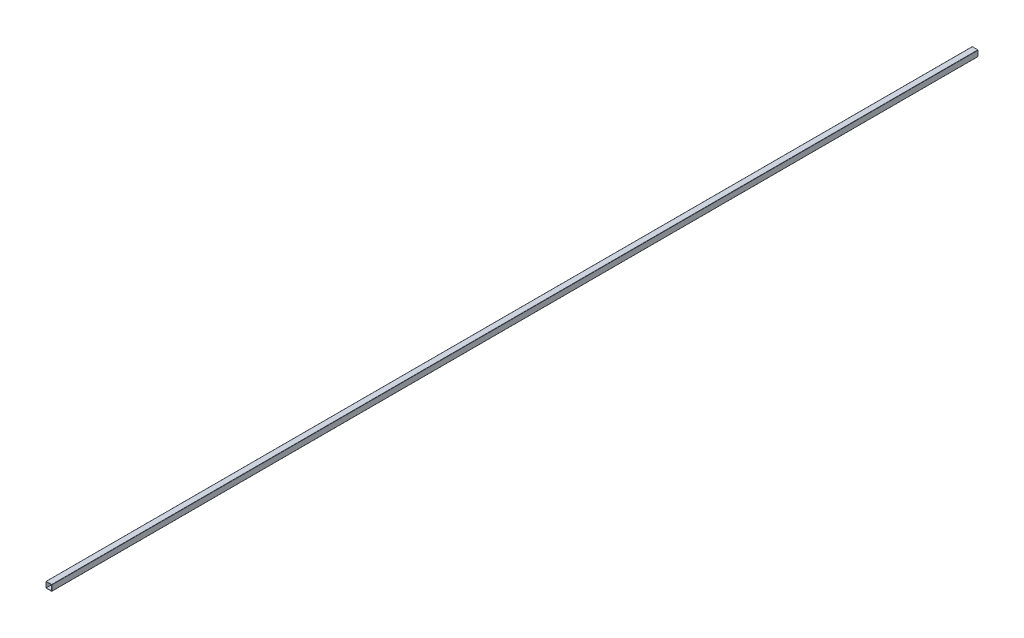
ISO-10303-21;
HEADER;
FILE_DESCRIPTION(('STEP AP214'),'2;1');
FILE_NAME('part.step','',(''),(''),'','','');
FILE_SCHEMA(('AUTOMOTIVE_DESIGN { 1 0 10303 214 1 1 1 1 }'));
ENDSEC;
DATA;
#1=APPLICATION_CONTEXT('core data for automotive mechanical design processes');
#2=APPLICATION_PROTOCOL_DEFINITION('international standard','automotive_design',2000,#1);
#3=PRODUCT_CONTEXT('',#1,'mechanical');
#4=PRODUCT('Part','Part','',(#3));
#5=PRODUCT_RELATED_PRODUCT_CATEGORY('part','',(#4));
#6=PRODUCT_DEFINITION_FORMATION('','',#4);
#7=PRODUCT_DEFINITION_CONTEXT('part definition',#1,'design');
#8=PRODUCT_DEFINITION('design','',#6,#7);
#9=PRODUCT_DEFINITION_SHAPE('','',#8);
#10=(LENGTH_UNIT() NAMED_UNIT(*) SI_UNIT(.MILLI.,.METRE.));
#11=(NAMED_UNIT(*) PLANE_ANGLE_UNIT() SI_UNIT($,.RADIAN.));
#12=(NAMED_UNIT(*) SI_UNIT($,.STERADIAN.) SOLID_ANGLE_UNIT());
#13=UNCERTAINTY_MEASURE_WITH_UNIT(LENGTH_MEASURE(1.E-05),#10,'distance_accuracy_value','');
#14=(GEOMETRIC_REPRESENTATION_CONTEXT(3) GLOBAL_UNCERTAINTY_ASSIGNED_CONTEXT((#13)) GLOBAL_UNIT_ASSIGNED_CONTEXT((#10,
#11,#12)) REPRESENTATION_CONTEXT('',''));
#15=CARTESIAN_POINT('',(0.,0.,0.));
#16=DIRECTION('',(0.,0.,1.));
#17=DIRECTION('',(1.,0.,0.));
#18=AXIS2_PLACEMENT_3D('',#15,#16,#17);
#19=CARTESIAN_POINT('',(17.55,17.55,6000.));
#20=DIRECTION('',(0.,0.,-1.));
#21=DIRECTION('',(-1.,0.,0.));
#22=AXIS2_PLACEMENT_3D('',#19,#20,#21);
#23=PLANE('',#22);
#24=CARTESIAN_POINT('',(17.55,17.55,6000.));
#25=DIRECTION('',(0.,0.,1.));
#26=DIRECTION('',(-1.,0.,0.));
#27=AXIS2_PLACEMENT_3D('',#24,#25,#26);
#28=CIRCLE('',#27,1.5);
#29=CARTESIAN_POINT('',(19.05,17.55,6000.));
#30=VERTEX_POINT('',#29);
#31=CARTESIAN_POINT('',(17.55,19.05,6000.));
#32=VERTEX_POINT('',#31);
#33=EDGE_CURVE('E158',#30,#32,#28,.T.);
#34=ORIENTED_EDGE('',*,*,#33,.T.);
#35=DIRECTION('',(-1.,0.,0.));
#36=VECTOR('',#35,1.);
#37=CARTESIAN_POINT('',(-17.55,19.05,6000.));
#38=LINE('',#37,#36);
#39=CARTESIAN_POINT('',(-17.55,19.05,6000.));
#40=VERTEX_POINT('',#39);
#41=EDGE_CURVE('E161',#32,#40,#38,.T.);
#42=ORIENTED_EDGE('',*,*,#41,.T.);
#43=CARTESIAN_POINT('',(-17.55,17.55,6000.));
#44=DIRECTION('',(0.,0.,1.));
#45=DIRECTION('',(-1.,0.,0.));
#46=AXIS2_PLACEMENT_3D('',#43,#44,#45);
#47=CIRCLE('',#46,1.5);
#48=CARTESIAN_POINT('',(-19.05,17.55,6000.));
#49=VERTEX_POINT('',#48);
#50=EDGE_CURVE('E164',#40,#49,#47,.T.);
#51=ORIENTED_EDGE('',*,*,#50,.T.);
#52=DIRECTION('',(0.,-1.,0.));
#53=VECTOR('',#52,1.);
#54=CARTESIAN_POINT('',(-19.05,-17.55,6000.));
#55=LINE('',#54,#53);
#56=CARTESIAN_POINT('',(-19.05,-17.55,6000.));
#57=VERTEX_POINT('',#56);
#58=EDGE_CURVE('E166',#49,#57,#55,.T.);
#59=ORIENTED_EDGE('',*,*,#58,.T.);
#60=CARTESIAN_POINT('',(-17.55,-17.55,6000.));
#61=DIRECTION('',(0.,0.,1.));
#62=DIRECTION('',(-1.,0.,0.));
#63=AXIS2_PLACEMENT_3D('',#60,#61,#62);
#64=CIRCLE('',#63,1.5);
#65=CARTESIAN_POINT('',(-17.55,-19.05,6000.));
#66=VERTEX_POINT('',#65);
#67=EDGE_CURVE('E168',#57,#66,#64,.T.);
#68=ORIENTED_EDGE('',*,*,#67,.T.);
#69=DIRECTION('',(1.,0.,0.));
#70=VECTOR('',#69,1.);
#71=CARTESIAN_POINT('',(-17.55,-19.05,6000.));
#72=LINE('',#71,#70);
#73=CARTESIAN_POINT('',(17.55,-19.05,6000.));
#74=VERTEX_POINT('',#73);
#75=EDGE_CURVE('E170',#66,#74,#72,.T.);
#76=ORIENTED_EDGE('',*,*,#75,.T.);
#77=CARTESIAN_POINT('',(17.55,-17.55,6000.));
#78=DIRECTION('',(0.,0.,1.));
#79=DIRECTION('',(1.,0.,0.));
#80=AXIS2_PLACEMENT_3D('',#77,#78,#79);
#81=CIRCLE('',#80,1.5);
#82=CARTESIAN_POINT('',(19.05,-17.55,6000.));
#83=VERTEX_POINT('',#82);
#84=EDGE_CURVE('E172',#74,#83,#81,.T.);
#85=ORIENTED_EDGE('',*,*,#84,.T.);
#86=DIRECTION('',(0.,1.,0.));
#87=VECTOR('',#86,1.);
#88=CARTESIAN_POINT('',(19.05,-17.55,6000.));
#89=LINE('',#88,#87);
#90=EDGE_CURVE('E174',#83,#30,#89,.T.);
#91=ORIENTED_EDGE('',*,*,#90,.T.);
#92=EDGE_LOOP('',(#34,#42,#51,#59,#68,#76,#85,#91));
#93=FACE_BOUND('',#92,.T.);
#94=DIRECTION('',(1.,0.,0.));
#95=VECTOR('',#94,1.);
#96=CARTESIAN_POINT('',(-17.55,-17.55,6000.));
#97=LINE('',#96,#95);
#98=CARTESIAN_POINT('',(-17.55,-17.55,6000.));
#99=VERTEX_POINT('',#98);
#100=CARTESIAN_POINT('',(17.55,-17.55,6000.));
#101=VERTEX_POINT('',#100);
#102=EDGE_CURVE('E122',#99,#101,#97,.T.);
#103=ORIENTED_EDGE('',*,*,#102,.F.);
#104=DIRECTION('',(0.,-1.,0.));
#105=VECTOR('',#104,1.);
#106=CARTESIAN_POINT('',(-17.55,-17.55,6000.));
#107=LINE('',#106,#105);
#108=CARTESIAN_POINT('',(-17.55,17.55,6000.));
#109=VERTEX_POINT('',#108);
#110=EDGE_CURVE('E144',#109,#99,#107,.T.);
#111=ORIENTED_EDGE('',*,*,#110,.F.);
#112=DIRECTION('',(-1.,0.,0.));
#113=VECTOR('',#112,1.);
#114=CARTESIAN_POINT('',(-17.55,17.55,6000.));
#115=LINE('',#114,#113);
#116=CARTESIAN_POINT('',(17.55,17.55,6000.));
#117=VERTEX_POINT('',#116);
#118=EDGE_CURVE('E142',#117,#109,#115,.T.);
#119=ORIENTED_EDGE('',*,*,#118,.F.);
#120=DIRECTION('',(0.,1.,0.));
#121=VECTOR('',#120,1.);
#122=CARTESIAN_POINT('',(17.55,-17.55,6000.));
#123=LINE('',#122,#121);
#124=EDGE_CURVE('E130',#101,#117,#123,.T.);
#125=ORIENTED_EDGE('',*,*,#124,.F.);
#126=EDGE_LOOP('',(#103,#111,#119,#125));
#127=FACE_BOUND('',#126,.T.);
#128=ADVANCED_FACE('F33',(#93,#127),#23,.F.);
#129=CARTESIAN_POINT('',(17.55,17.55,0.));
#130=DIRECTION('',(0.,0.,-1.));
#131=DIRECTION('',(-1.,0.,0.));
#132=AXIS2_PLACEMENT_3D('',#129,#130,#131);
#133=PLANE('',#132);
#134=CARTESIAN_POINT('',(17.55,17.55,0.));
#135=DIRECTION('',(0.,0.,1.));
#136=DIRECTION('',(-1.,0.,0.));
#137=AXIS2_PLACEMENT_3D('',#134,#135,#136);
#138=CIRCLE('',#137,1.5);
#139=CARTESIAN_POINT('',(19.05,17.55,0.));
#140=VERTEX_POINT('',#139);
#141=CARTESIAN_POINT('',(17.55,19.05,0.));
#142=VERTEX_POINT('',#141);
#143=EDGE_CURVE('E138',#140,#142,#138,.T.);
#144=ORIENTED_EDGE('',*,*,#143,.F.);
#145=DIRECTION('',(0.,1.,0.));
#146=VECTOR('',#145,1.);
#147=CARTESIAN_POINT('',(19.05,-17.55,0.));
#148=LINE('',#147,#146);
#149=CARTESIAN_POINT('',(19.05,-17.55,0.));
#150=VERTEX_POINT('',#149);
#151=EDGE_CURVE('E162',#150,#140,#148,.T.);
#152=ORIENTED_EDGE('',*,*,#151,.F.);
#153=CARTESIAN_POINT('',(17.55,-17.55,0.));
#154=DIRECTION('',(0.,0.,1.));
#155=DIRECTION('',(1.,0.,0.));
#156=AXIS2_PLACEMENT_3D('',#153,#154,#155);
#157=CIRCLE('',#156,1.5);
#158=CARTESIAN_POINT('',(17.55,-19.05,0.));
#159=VERTEX_POINT('',#158);
#160=EDGE_CURVE('E189',#159,#150,#157,.T.);
#161=ORIENTED_EDGE('',*,*,#160,.F.);
#162=DIRECTION('',(1.,0.,0.));
#163=VECTOR('',#162,1.);
#164=CARTESIAN_POINT('',(-17.55,-19.05,0.));
#165=LINE('',#164,#163);
#166=CARTESIAN_POINT('',(-17.55,-19.05,0.));
#167=VERTEX_POINT('',#166);
#168=EDGE_CURVE('E187',#167,#159,#165,.T.);
#169=ORIENTED_EDGE('',*,*,#168,.F.);
#170=CARTESIAN_POINT('',(-17.55,-17.55,0.));
#171=DIRECTION('',(0.,0.,1.));
#172=DIRECTION('',(-1.,0.,0.));
#173=AXIS2_PLACEMENT_3D('',#170,#171,#172);
#174=CIRCLE('',#173,1.5);
#175=CARTESIAN_POINT('',(-19.05,-17.55,0.));
#176=VERTEX_POINT('',#175);
#177=EDGE_CURVE('E185',#176,#167,#174,.T.);
#178=ORIENTED_EDGE('',*,*,#177,.F.);
#179=DIRECTION('',(0.,-1.,0.));
#180=VECTOR('',#179,1.);
#181=CARTESIAN_POINT('',(-19.05,-17.55,0.));
#182=LINE('',#181,#180);
#183=CARTESIAN_POINT('',(-19.05,17.55,0.));
#184=VERTEX_POINT('',#183);
#185=EDGE_CURVE('E183',#184,#176,#182,.T.);
#186=ORIENTED_EDGE('',*,*,#185,.F.);
#187=CARTESIAN_POINT('',(-17.55,17.55,0.));
#188=DIRECTION('',(0.,0.,1.));
#189=DIRECTION('',(-1.,0.,0.));
#190=AXIS2_PLACEMENT_3D('',#187,#188,#189);
#191=CIRCLE('',#190,1.5);
#192=CARTESIAN_POINT('',(-17.55,19.05,0.));
#193=VERTEX_POINT('',#192);
#194=EDGE_CURVE('E181',#193,#184,#191,.T.);
#195=ORIENTED_EDGE('',*,*,#194,.F.);
#196=DIRECTION('',(-1.,0.,0.));
#197=VECTOR('',#196,1.);
#198=CARTESIAN_POINT('',(-17.55,19.05,0.));
#199=LINE('',#198,#197);
#200=EDGE_CURVE('E179',#142,#193,#199,.T.);
#201=ORIENTED_EDGE('',*,*,#200,.F.);
#202=EDGE_LOOP('',(#144,#152,#161,#169,#178,#186,#195,#201));
#203=FACE_BOUND('',#202,.T.);
#204=DIRECTION('',(0.,-1.,0.));
#205=VECTOR('',#204,1.);
#206=CARTESIAN_POINT('',(-17.55,-17.55,0.));
#207=LINE('',#206,#205);
#208=CARTESIAN_POINT('',(-17.55,17.55,0.));
#209=VERTEX_POINT('',#208);
#210=CARTESIAN_POINT('',(-17.55,-17.55,0.));
#211=VERTEX_POINT('',#210);
#212=EDGE_CURVE('E131',#209,#211,#207,.T.);
#213=ORIENTED_EDGE('',*,*,#212,.T.);
#214=DIRECTION('',(1.,0.,0.));
#215=VECTOR('',#214,1.);
#216=CARTESIAN_POINT('',(-17.55,-17.55,0.));
#217=LINE('',#216,#215);
#218=CARTESIAN_POINT('',(17.55,-17.55,0.));
#219=VERTEX_POINT('',#218);
#220=EDGE_CURVE('E56',#211,#219,#217,.T.);
#221=ORIENTED_EDGE('',*,*,#220,.T.);
#222=DIRECTION('',(0.,1.,0.));
#223=VECTOR('',#222,1.);
#224=CARTESIAN_POINT('',(17.55,-17.55,0.));
#225=LINE('',#224,#223);
#226=CARTESIAN_POINT('',(17.55,17.55,0.));
#227=VERTEX_POINT('',#226);
#228=EDGE_CURVE('E137',#219,#227,#225,.T.);
#229=ORIENTED_EDGE('',*,*,#228,.T.);
#230=DIRECTION('',(-1.,0.,0.));
#231=VECTOR('',#230,1.);
#232=CARTESIAN_POINT('',(-17.55,17.55,0.));
#233=LINE('',#232,#231);
#234=EDGE_CURVE('E150',#227,#209,#233,.T.);
#235=ORIENTED_EDGE('',*,*,#234,.T.);
#236=EDGE_LOOP('',(#213,#221,#229,#235));
#237=FACE_BOUND('',#236,.T.);
#238=ADVANCED_FACE('F219',(#203,#237),#133,.T.);
#239=CARTESIAN_POINT('',(17.55,17.55,6000.));
#240=DIRECTION('',(0.,0.,-1.));
#241=DIRECTION('',(-1.,0.,0.));
#242=AXIS2_PLACEMENT_3D('',#239,#240,#241);
#243=CYLINDRICAL_SURFACE('',#242,1.5);
#244=ORIENTED_EDGE('',*,*,#143,.T.);
#245=DIRECTION('',(0.,0.,-1.));
#246=VECTOR('',#245,1.);
#247=CARTESIAN_POINT('',(17.55,19.05,6000.));
#248=LINE('',#247,#246);
#249=EDGE_CURVE('E11',#32,#142,#248,.T.);
#250=ORIENTED_EDGE('',*,*,#249,.F.);
#251=ORIENTED_EDGE('',*,*,#33,.F.);
#252=DIRECTION('',(0.,0.,-1.));
#253=VECTOR('',#252,1.);
#254=CARTESIAN_POINT('',(19.05,17.55,6000.));
#255=LINE('',#254,#253);
#256=EDGE_CURVE('E176',#30,#140,#255,.T.);
#257=ORIENTED_EDGE('',*,*,#256,.T.);
#258=EDGE_LOOP('',(#244,#250,#251,#257));
#259=FACE_BOUND('',#258,.T.);
#260=ADVANCED_FACE('F35',(#259),#243,.T.);
#261=CARTESIAN_POINT('',(-17.55,19.05,6000.));
#262=DIRECTION('',(0.,-1.,0.));
#263=DIRECTION('',(0.,0.,-1.));
#264=AXIS2_PLACEMENT_3D('',#261,#262,#263);
#265=PLANE('',#264);
#266=ORIENTED_EDGE('',*,*,#200,.T.);
#267=DIRECTION('',(0.,0.,-1.));
#268=VECTOR('',#267,1.);
#269=CARTESIAN_POINT('',(-17.55,19.05,6000.));
#270=LINE('',#269,#268);
#271=EDGE_CURVE('E41',#40,#193,#270,.T.);
#272=ORIENTED_EDGE('',*,*,#271,.F.);
#273=ORIENTED_EDGE('',*,*,#41,.F.);
#274=ORIENTED_EDGE('',*,*,#249,.T.);
#275=EDGE_LOOP('',(#266,#272,#273,#274));
#276=FACE_BOUND('',#275,.T.);
#277=ADVANCED_FACE('F236',(#276),#265,.F.);
#278=CARTESIAN_POINT('',(-17.55,17.55,6000.));
#279=DIRECTION('',(0.,0.,-1.));
#280=DIRECTION('',(-1.,0.,0.));
#281=AXIS2_PLACEMENT_3D('',#278,#279,#280);
#282=CYLINDRICAL_SURFACE('',#281,1.5);
#283=ORIENTED_EDGE('',*,*,#194,.T.);
#284=DIRECTION('',(0.,0.,-1.));
#285=VECTOR('',#284,1.);
#286=CARTESIAN_POINT('',(-19.05,17.55,6000.));
#287=LINE('',#286,#285);
#288=EDGE_CURVE('E206',#49,#184,#287,.T.);
#289=ORIENTED_EDGE('',*,*,#288,.F.);
#290=ORIENTED_EDGE('',*,*,#50,.F.);
#291=ORIENTED_EDGE('',*,*,#271,.T.);
#292=EDGE_LOOP('',(#283,#289,#290,#291));
#293=FACE_BOUND('',#292,.T.);
#294=ADVANCED_FACE('F213',(#293),#282,.T.);
#295=CARTESIAN_POINT('',(-19.05,-17.55,6000.));
#296=DIRECTION('',(1.,0.,0.));
#297=DIRECTION('',(0.,0.,-1.));
#298=AXIS2_PLACEMENT_3D('',#295,#296,#297);
#299=PLANE('',#298);
#300=ORIENTED_EDGE('',*,*,#185,.T.);
#301=DIRECTION('',(0.,0.,-1.));
#302=VECTOR('',#301,1.);
#303=CARTESIAN_POINT('',(-19.05,-17.55,6000.));
#304=LINE('',#303,#302);
#305=EDGE_CURVE('E203',#57,#176,#304,.T.);
#306=ORIENTED_EDGE('',*,*,#305,.F.);
#307=ORIENTED_EDGE('',*,*,#58,.F.);
#308=ORIENTED_EDGE('',*,*,#288,.T.);
#309=EDGE_LOOP('',(#300,#306,#307,#308));
#310=FACE_BOUND('',#309,.T.);
#311=ADVANCED_FACE('F225',(#310),#299,.F.);
#312=CARTESIAN_POINT('',(-17.55,-17.55,6000.));
#313=DIRECTION('',(0.,0.,-1.));
#314=DIRECTION('',(-1.,0.,0.));
#315=AXIS2_PLACEMENT_3D('',#312,#313,#314);
#316=CYLINDRICAL_SURFACE('',#315,1.5);
#317=ORIENTED_EDGE('',*,*,#177,.T.);
#318=DIRECTION('',(0.,0.,-1.));
#319=VECTOR('',#318,1.);
#320=CARTESIAN_POINT('',(-17.55,-19.05,6000.));
#321=LINE('',#320,#319);
#322=EDGE_CURVE('E200',#66,#167,#321,.T.);
#323=ORIENTED_EDGE('',*,*,#322,.F.);
#324=ORIENTED_EDGE('',*,*,#67,.F.);
#325=ORIENTED_EDGE('',*,*,#305,.T.);
#326=EDGE_LOOP('',(#317,#323,#324,#325));
#327=FACE_BOUND('',#326,.T.);
#328=ADVANCED_FACE('F229',(#327),#316,.T.);
#329=CARTESIAN_POINT('',(-17.55,-19.05,6000.));
#330=DIRECTION('',(0.,1.,0.));
#331=DIRECTION('',(0.,0.,1.));
#332=AXIS2_PLACEMENT_3D('',#329,#330,#331);
#333=PLANE('',#332);
#334=ORIENTED_EDGE('',*,*,#168,.T.);
#335=DIRECTION('',(0.,0.,-1.));
#336=VECTOR('',#335,1.);
#337=CARTESIAN_POINT('',(17.55,-19.05,6000.));
#338=LINE('',#337,#336);
#339=EDGE_CURVE('E197',#74,#159,#338,.T.);
#340=ORIENTED_EDGE('',*,*,#339,.F.);
#341=ORIENTED_EDGE('',*,*,#75,.F.);
#342=ORIENTED_EDGE('',*,*,#322,.T.);
#343=EDGE_LOOP('',(#334,#340,#341,#342));
#344=FACE_BOUND('',#343,.T.);
#345=ADVANCED_FACE('F249',(#344),#333,.F.);
#346=CARTESIAN_POINT('',(17.55,-17.55,6000.));
#347=DIRECTION('',(0.,0.,-1.));
#348=DIRECTION('',(-1.,0.,0.));
#349=AXIS2_PLACEMENT_3D('',#346,#347,#348);
#350=CYLINDRICAL_SURFACE('',#349,1.5);
#351=ORIENTED_EDGE('',*,*,#160,.T.);
#352=DIRECTION('',(0.,0.,-1.));
#353=VECTOR('',#352,1.);
#354=CARTESIAN_POINT('',(19.05,-17.55,6000.));
#355=LINE('',#354,#353);
#356=EDGE_CURVE('E194',#83,#150,#355,.T.);
#357=ORIENTED_EDGE('',*,*,#356,.F.);
#358=ORIENTED_EDGE('',*,*,#84,.F.);
#359=ORIENTED_EDGE('',*,*,#339,.T.);
#360=EDGE_LOOP('',(#351,#357,#358,#359));
#361=FACE_BOUND('',#360,.T.);
#362=ADVANCED_FACE('F247',(#361),#350,.T.);
#363=CARTESIAN_POINT('',(19.05,-17.55,6000.));
#364=DIRECTION('',(-1.,0.,0.));
#365=DIRECTION('',(0.,0.,1.));
#366=AXIS2_PLACEMENT_3D('',#363,#364,#365);
#367=PLANE('',#366);
#368=ORIENTED_EDGE('',*,*,#151,.T.);
#369=ORIENTED_EDGE('',*,*,#256,.F.);
#370=ORIENTED_EDGE('',*,*,#90,.F.);
#371=ORIENTED_EDGE('',*,*,#356,.T.);
#372=EDGE_LOOP('',(#368,#369,#370,#371));
#373=FACE_BOUND('',#372,.T.);
#374=ADVANCED_FACE('F242',(#373),#367,.F.);
#375=CARTESIAN_POINT('',(-17.55,-17.55,6000.));
#376=DIRECTION('',(0.,1.,0.));
#377=DIRECTION('',(-1.,0.,0.));
#378=AXIS2_PLACEMENT_3D('',#375,#376,#377);
#379=PLANE('',#378);
#380=ORIENTED_EDGE('',*,*,#220,.F.);
#381=DIRECTION('',(0.,0.,-1.));
#382=VECTOR('',#381,1.);
#383=CARTESIAN_POINT('',(-17.55,-17.55,6000.));
#384=LINE('',#383,#382);
#385=EDGE_CURVE('E126',#99,#211,#384,.T.);
#386=ORIENTED_EDGE('',*,*,#385,.F.);
#387=ORIENTED_EDGE('',*,*,#102,.T.);
#388=DIRECTION('',(0.,0.,-1.));
#389=VECTOR('',#388,1.);
#390=CARTESIAN_POINT('',(17.55,-17.55,6000.));
#391=LINE('',#390,#389);
#392=EDGE_CURVE('E125',#101,#219,#391,.T.);
#393=ORIENTED_EDGE('',*,*,#392,.T.);
#394=EDGE_LOOP('',(#380,#386,#387,#393));
#395=FACE_BOUND('',#394,.T.);
#396=ADVANCED_FACE('F124',(#395),#379,.T.);
#397=CARTESIAN_POINT('',(17.55,-17.55,6000.));
#398=DIRECTION('',(-1.,0.,0.));
#399=DIRECTION('',(0.,-1.,0.));
#400=AXIS2_PLACEMENT_3D('',#397,#398,#399);
#401=PLANE('',#400);
#402=ORIENTED_EDGE('',*,*,#228,.F.);
#403=ORIENTED_EDGE('',*,*,#392,.F.);
#404=ORIENTED_EDGE('',*,*,#124,.T.);
#405=DIRECTION('',(0.,0.,-1.));
#406=VECTOR('',#405,1.);
#407=CARTESIAN_POINT('',(17.55,17.55,6000.));
#408=LINE('',#407,#406);
#409=EDGE_CURVE('E139',#117,#227,#408,.T.);
#410=ORIENTED_EDGE('',*,*,#409,.T.);
#411=EDGE_LOOP('',(#402,#403,#404,#410));
#412=FACE_BOUND('',#411,.T.);
#413=ADVANCED_FACE('F134',(#412),#401,.T.);
#414=CARTESIAN_POINT('',(-17.55,17.55,6000.));
#415=DIRECTION('',(0.,-1.,0.));
#416=DIRECTION('',(1.,0.,0.));
#417=AXIS2_PLACEMENT_3D('',#414,#415,#416);
#418=PLANE('',#417);
#419=ORIENTED_EDGE('',*,*,#234,.F.);
#420=ORIENTED_EDGE('',*,*,#409,.F.);
#421=ORIENTED_EDGE('',*,*,#118,.T.);
#422=DIRECTION('',(0.,0.,-1.));
#423=VECTOR('',#422,1.);
#424=CARTESIAN_POINT('',(-17.55,17.55,6000.));
#425=LINE('',#424,#423);
#426=EDGE_CURVE('E48',#109,#209,#425,.T.);
#427=ORIENTED_EDGE('',*,*,#426,.T.);
#428=EDGE_LOOP('',(#419,#420,#421,#427));
#429=FACE_BOUND('',#428,.T.);
#430=ADVANCED_FACE('F274',(#429),#418,.T.);
#431=CARTESIAN_POINT('',(-17.55,-17.55,6000.));
#432=DIRECTION('',(1.,0.,0.));
#433=DIRECTION('',(0.,0.,-1.));
#434=AXIS2_PLACEMENT_3D('',#431,#432,#433);
#435=PLANE('',#434);
#436=ORIENTED_EDGE('',*,*,#212,.F.);
#437=ORIENTED_EDGE('',*,*,#426,.F.);
#438=ORIENTED_EDGE('',*,*,#110,.T.);
#439=ORIENTED_EDGE('',*,*,#385,.T.);
#440=EDGE_LOOP('',(#436,#437,#438,#439));
#441=FACE_BOUND('',#440,.T.);
#442=ADVANCED_FACE('F278',(#441),#435,.T.);
#443=CLOSED_SHELL('',(#128,#238,#260,#277,#294,#311,#328,#345,#362,#374,#396,#413,#430,#442));
#444=MANIFOLD_SOLID_BREP('B2',#443);
#445=ADVANCED_BREP_SHAPE_REPRESENTATION('',(#18,#444),#14);
#446=SHAPE_DEFINITION_REPRESENTATION(#9,#445);
ENDSEC;
END-ISO-10303-21;
